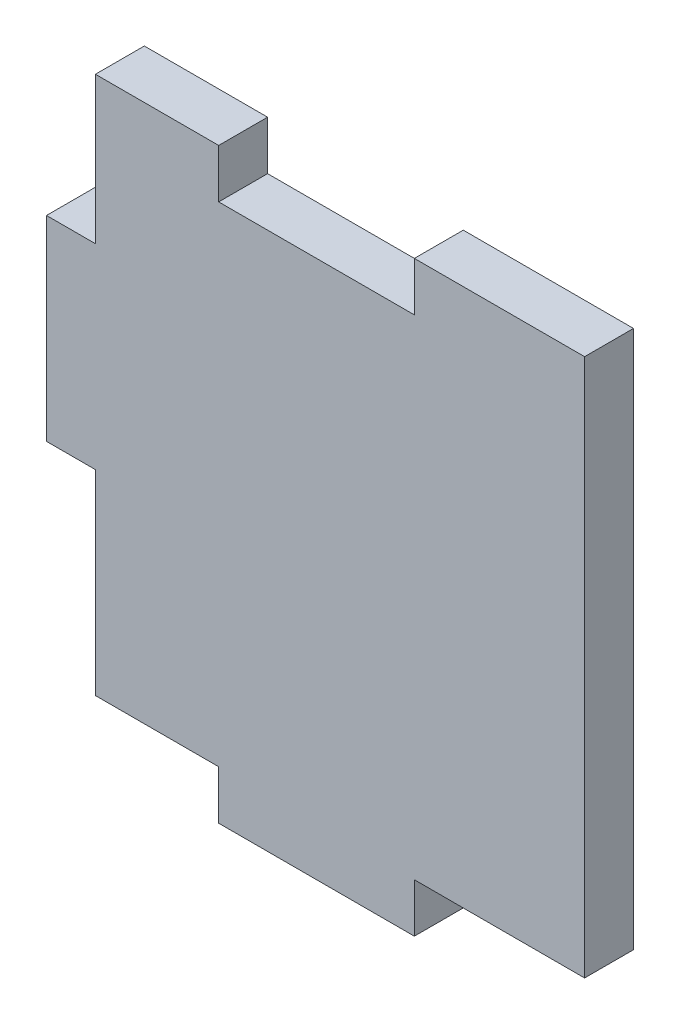
ISO-10303-21;
HEADER;
FILE_DESCRIPTION(('STEP AP214'),'2;1');
FILE_NAME('part.step','',(''),(''),'','','');
FILE_SCHEMA(('AUTOMOTIVE_DESIGN { 1 0 10303 214 1 1 1 1 }'));
ENDSEC;
DATA;
#1=APPLICATION_CONTEXT('core data for automotive mechanical design processes');
#2=APPLICATION_PROTOCOL_DEFINITION('international standard','automotive_design',2000,#1);
#3=PRODUCT_CONTEXT('',#1,'mechanical');
#4=PRODUCT('Part','Part','',(#3));
#5=PRODUCT_RELATED_PRODUCT_CATEGORY('part','',(#4));
#6=PRODUCT_DEFINITION_FORMATION('','',#4);
#7=PRODUCT_DEFINITION_CONTEXT('part definition',#1,'design');
#8=PRODUCT_DEFINITION('design','',#6,#7);
#9=PRODUCT_DEFINITION_SHAPE('','',#8);
#10=(LENGTH_UNIT() NAMED_UNIT(*) SI_UNIT(.MILLI.,.METRE.));
#11=(NAMED_UNIT(*) PLANE_ANGLE_UNIT() SI_UNIT($,.RADIAN.));
#12=(NAMED_UNIT(*) SI_UNIT($,.STERADIAN.) SOLID_ANGLE_UNIT());
#13=UNCERTAINTY_MEASURE_WITH_UNIT(LENGTH_MEASURE(1.E-05),#10,'distance_accuracy_value','');
#14=(GEOMETRIC_REPRESENTATION_CONTEXT(3) GLOBAL_UNCERTAINTY_ASSIGNED_CONTEXT((#13)) GLOBAL_UNIT_ASSIGNED_CONTEXT((#10,
#11,#12)) REPRESENTATION_CONTEXT('',''));
#15=CARTESIAN_POINT('',(0.,0.,0.));
#16=DIRECTION('',(0.,0.,1.));
#17=DIRECTION('',(1.,0.,0.));
#18=AXIS2_PLACEMENT_3D('',#15,#16,#17);
#19=CARTESIAN_POINT('',(0.,31.75,6.35));
#20=DIRECTION('',(1.,0.,0.));
#21=DIRECTION('',(0.,0.,-1.));
#22=AXIS2_PLACEMENT_3D('',#19,#20,#21);
#23=PLANE('',#22);
#24=DIRECTION('',(0.,-1.,0.));
#25=VECTOR('',#24,1.);
#26=CARTESIAN_POINT('',(0.,31.75,0.));
#27=LINE('',#26,#25);
#28=CARTESIAN_POINT('',(0.,31.75,0.));
#29=VERTEX_POINT('',#28);
#30=CARTESIAN_POINT('',(0.,6.34999999999999,0.));
#31=VERTEX_POINT('',#30);
#32=EDGE_CURVE('E175',#29,#31,#27,.T.);
#33=ORIENTED_EDGE('',*,*,#32,.T.);
#34=DIRECTION('',(0.,0.,-1.));
#35=VECTOR('',#34,1.);
#36=CARTESIAN_POINT('',(0.,6.34999999999999,6.35));
#37=LINE('',#36,#35);
#38=CARTESIAN_POINT('',(0.,6.34999999999999,6.35));
#39=VERTEX_POINT('',#38);
#40=EDGE_CURVE('E11',#39,#31,#37,.T.);
#41=ORIENTED_EDGE('',*,*,#40,.F.);
#42=DIRECTION('',(0.,-1.,0.));
#43=VECTOR('',#42,1.);
#44=CARTESIAN_POINT('',(0.,31.75,6.35));
#45=LINE('',#44,#43);
#46=CARTESIAN_POINT('',(0.,31.75,6.35));
#47=VERTEX_POINT('',#46);
#48=EDGE_CURVE('E205',#47,#39,#45,.T.);
#49=ORIENTED_EDGE('',*,*,#48,.F.);
#50=DIRECTION('',(0.,0.,-1.));
#51=VECTOR('',#50,1.);
#52=CARTESIAN_POINT('',(0.,31.75,6.35));
#53=LINE('',#52,#51);
#54=EDGE_CURVE('E171',#47,#29,#53,.T.);
#55=ORIENTED_EDGE('',*,*,#54,.T.);
#56=EDGE_LOOP('',(#33,#41,#49,#55));
#57=FACE_BOUND('',#56,.T.);
#58=ADVANCED_FACE('F31',(#57),#23,.F.);
#59=CARTESIAN_POINT('',(0.,6.34999999999999,6.35));
#60=DIRECTION('',(0.,1.,0.));
#61=DIRECTION('',(-1.,0.,0.));
#62=AXIS2_PLACEMENT_3D('',#59,#60,#61);
#63=PLANE('',#62);
#64=DIRECTION('',(1.,0.,0.));
#65=VECTOR('',#64,1.);
#66=CARTESIAN_POINT('',(0.,6.34999999999999,0.));
#67=LINE('',#66,#65);
#68=CARTESIAN_POINT('',(16.002,6.35,0.));
#69=VERTEX_POINT('',#68);
#70=EDGE_CURVE('E178',#31,#69,#67,.T.);
#71=ORIENTED_EDGE('',*,*,#70,.T.);
#72=DIRECTION('',(0.,0.,-1.));
#73=VECTOR('',#72,1.);
#74=CARTESIAN_POINT('',(16.002,6.35,6.35));
#75=LINE('',#74,#73);
#76=CARTESIAN_POINT('',(16.002,6.35,6.35));
#77=VERTEX_POINT('',#76);
#78=EDGE_CURVE('E39',#77,#69,#75,.T.);
#79=ORIENTED_EDGE('',*,*,#78,.F.);
#80=DIRECTION('',(1.,0.,0.));
#81=VECTOR('',#80,1.);
#82=CARTESIAN_POINT('',(0.,6.34999999999999,6.35));
#83=LINE('',#82,#81);
#84=EDGE_CURVE('E114',#39,#77,#83,.T.);
#85=ORIENTED_EDGE('',*,*,#84,.F.);
#86=ORIENTED_EDGE('',*,*,#40,.T.);
#87=EDGE_LOOP('',(#71,#79,#85,#86));
#88=FACE_BOUND('',#87,.T.);
#89=ADVANCED_FACE('F303',(#88),#63,.F.);
#90=CARTESIAN_POINT('',(16.002,6.35,6.35));
#91=DIRECTION('',(1.,0.,0.));
#92=DIRECTION('',(0.,1.,0.));
#93=AXIS2_PLACEMENT_3D('',#90,#91,#92);
#94=PLANE('',#93);
#95=DIRECTION('',(0.,-1.,0.));
#96=VECTOR('',#95,1.);
#97=CARTESIAN_POINT('',(16.002,6.35,0.));
#98=LINE('',#97,#96);
#99=CARTESIAN_POINT('',(16.002,0.,0.));
#100=VERTEX_POINT('',#99);
#101=EDGE_CURVE('E180',#69,#100,#98,.T.);
#102=ORIENTED_EDGE('',*,*,#101,.T.);
#103=DIRECTION('',(0.,0.,-1.));
#104=VECTOR('',#103,1.);
#105=CARTESIAN_POINT('',(16.002,0.,6.35));
#106=LINE('',#105,#104);
#107=CARTESIAN_POINT('',(16.002,0.,6.35));
#108=VERTEX_POINT('',#107);
#109=EDGE_CURVE('E236',#108,#100,#106,.T.);
#110=ORIENTED_EDGE('',*,*,#109,.F.);
#111=DIRECTION('',(0.,-1.,0.));
#112=VECTOR('',#111,1.);
#113=CARTESIAN_POINT('',(16.002,6.35,6.35));
#114=LINE('',#113,#112);
#115=EDGE_CURVE('E244',#77,#108,#114,.T.);
#116=ORIENTED_EDGE('',*,*,#115,.F.);
#117=ORIENTED_EDGE('',*,*,#78,.T.);
#118=EDGE_LOOP('',(#102,#110,#116,#117));
#119=FACE_BOUND('',#118,.T.);
#120=ADVANCED_FACE('F242',(#119),#94,.F.);
#121=CARTESIAN_POINT('',(16.002,0.,6.35));
#122=DIRECTION('',(0.,1.,0.));
#123=DIRECTION('',(-1.,0.,0.));
#124=AXIS2_PLACEMENT_3D('',#121,#122,#123);
#125=PLANE('',#124);
#126=DIRECTION('',(1.,0.,0.));
#127=VECTOR('',#126,1.);
#128=CARTESIAN_POINT('',(16.002,0.,0.));
#129=LINE('',#128,#127);
#130=CARTESIAN_POINT('',(41.402,0.,0.));
#131=VERTEX_POINT('',#130);
#132=EDGE_CURVE('E182',#100,#131,#129,.T.);
#133=ORIENTED_EDGE('',*,*,#132,.T.);
#134=DIRECTION('',(0.,0.,-1.));
#135=VECTOR('',#134,1.);
#136=CARTESIAN_POINT('',(41.402,0.,6.35));
#137=LINE('',#136,#135);
#138=CARTESIAN_POINT('',(41.402,0.,6.35));
#139=VERTEX_POINT('',#138);
#140=EDGE_CURVE('E233',#139,#131,#137,.T.);
#141=ORIENTED_EDGE('',*,*,#140,.F.);
#142=DIRECTION('',(1.,0.,0.));
#143=VECTOR('',#142,1.);
#144=CARTESIAN_POINT('',(16.002,0.,6.35));
#145=LINE('',#144,#143);
#146=EDGE_CURVE('E262',#108,#139,#145,.T.);
#147=ORIENTED_EDGE('',*,*,#146,.F.);
#148=ORIENTED_EDGE('',*,*,#109,.T.);
#149=EDGE_LOOP('',(#133,#141,#147,#148));
#150=FACE_BOUND('',#149,.T.);
#151=ADVANCED_FACE('F253',(#150),#125,.F.);
#152=CARTESIAN_POINT('',(41.402,0.,6.35));
#153=DIRECTION('',(-1.,0.,0.));
#154=DIRECTION('',(0.,-1.,0.));
#155=AXIS2_PLACEMENT_3D('',#152,#153,#154);
#156=PLANE('',#155);
#157=DIRECTION('',(0.,1.,0.));
#158=VECTOR('',#157,1.);
#159=CARTESIAN_POINT('',(41.402,0.,0.));
#160=LINE('',#159,#158);
#161=CARTESIAN_POINT('',(41.402,6.35000000000001,0.));
#162=VERTEX_POINT('',#161);
#163=EDGE_CURVE('E184',#131,#162,#160,.T.);
#164=ORIENTED_EDGE('',*,*,#163,.T.);
#165=DIRECTION('',(0.,0.,-1.));
#166=VECTOR('',#165,1.);
#167=CARTESIAN_POINT('',(41.402,6.35000000000001,6.35));
#168=LINE('',#167,#166);
#169=CARTESIAN_POINT('',(41.402,6.35000000000001,6.35));
#170=VERTEX_POINT('',#169);
#171=EDGE_CURVE('E230',#170,#162,#168,.T.);
#172=ORIENTED_EDGE('',*,*,#171,.F.);
#173=DIRECTION('',(0.,1.,0.));
#174=VECTOR('',#173,1.);
#175=CARTESIAN_POINT('',(41.402,0.,6.35));
#176=LINE('',#175,#174);
#177=EDGE_CURVE('E259',#139,#170,#176,.T.);
#178=ORIENTED_EDGE('',*,*,#177,.F.);
#179=ORIENTED_EDGE('',*,*,#140,.T.);
#180=EDGE_LOOP('',(#164,#172,#178,#179));
#181=FACE_BOUND('',#180,.T.);
#182=ADVANCED_FACE('F257',(#181),#156,.F.);
#183=CARTESIAN_POINT('',(41.402,6.35000000000001,6.35));
#184=DIRECTION('',(0.,1.,0.));
#185=DIRECTION('',(-1.,0.,0.));
#186=AXIS2_PLACEMENT_3D('',#183,#184,#185);
#187=PLANE('',#186);
#188=DIRECTION('',(1.,0.,0.));
#189=VECTOR('',#188,1.);
#190=CARTESIAN_POINT('',(41.402,6.35000000000001,0.));
#191=LINE('',#190,#189);
#192=CARTESIAN_POINT('',(63.5,6.34999999999999,0.));
#193=VERTEX_POINT('',#192);
#194=EDGE_CURVE('E186',#162,#193,#191,.T.);
#195=ORIENTED_EDGE('',*,*,#194,.T.);
#196=DIRECTION('',(0.,0.,-1.));
#197=VECTOR('',#196,1.);
#198=CARTESIAN_POINT('',(63.5,6.34999999999999,6.35));
#199=LINE('',#198,#197);
#200=CARTESIAN_POINT('',(63.5,6.34999999999999,6.35));
#201=VERTEX_POINT('',#200);
#202=EDGE_CURVE('E227',#201,#193,#199,.T.);
#203=ORIENTED_EDGE('',*,*,#202,.F.);
#204=DIRECTION('',(1.,0.,0.));
#205=VECTOR('',#204,1.);
#206=CARTESIAN_POINT('',(41.402,6.35000000000001,6.35));
#207=LINE('',#206,#205);
#208=EDGE_CURVE('E261',#170,#201,#207,.T.);
#209=ORIENTED_EDGE('',*,*,#208,.F.);
#210=ORIENTED_EDGE('',*,*,#171,.T.);
#211=EDGE_LOOP('',(#195,#203,#209,#210));
#212=FACE_BOUND('',#211,.T.);
#213=ADVANCED_FACE('F316',(#212),#187,.F.);
#214=CARTESIAN_POINT('',(63.5,6.34999999999999,6.35));
#215=DIRECTION('',(-1.,0.,0.));
#216=DIRECTION('',(0.,0.,1.));
#217=AXIS2_PLACEMENT_3D('',#214,#215,#216);
#218=PLANE('',#217);
#219=DIRECTION('',(0.,1.,0.));
#220=VECTOR('',#219,1.);
#221=CARTESIAN_POINT('',(63.5,6.34999999999999,0.));
#222=LINE('',#221,#220);
#223=CARTESIAN_POINT('',(63.5,76.2,0.));
#224=VERTEX_POINT('',#223);
#225=EDGE_CURVE('E188',#193,#224,#222,.T.);
#226=ORIENTED_EDGE('',*,*,#225,.T.);
#227=DIRECTION('',(0.,0.,-1.));
#228=VECTOR('',#227,1.);
#229=CARTESIAN_POINT('',(63.5,76.2,6.35));
#230=LINE('',#229,#228);
#231=CARTESIAN_POINT('',(63.5,76.2,6.35));
#232=VERTEX_POINT('',#231);
#233=EDGE_CURVE('E224',#232,#224,#230,.T.);
#234=ORIENTED_EDGE('',*,*,#233,.F.);
#235=DIRECTION('',(0.,1.,0.));
#236=VECTOR('',#235,1.);
#237=CARTESIAN_POINT('',(63.5,6.34999999999999,6.35));
#238=LINE('',#237,#236);
#239=EDGE_CURVE('E264',#201,#232,#238,.T.);
#240=ORIENTED_EDGE('',*,*,#239,.F.);
#241=ORIENTED_EDGE('',*,*,#202,.T.);
#242=EDGE_LOOP('',(#226,#234,#240,#241));
#243=FACE_BOUND('',#242,.T.);
#244=ADVANCED_FACE('F319',(#243),#218,.F.);
#245=CARTESIAN_POINT('',(63.5,76.2,6.35));
#246=DIRECTION('',(0.,-1.,0.));
#247=DIRECTION('',(1.,0.,0.));
#248=AXIS2_PLACEMENT_3D('',#245,#246,#247);
#249=PLANE('',#248);
#250=DIRECTION('',(-1.,0.,0.));
#251=VECTOR('',#250,1.);
#252=CARTESIAN_POINT('',(63.5,76.2,0.));
#253=LINE('',#252,#251);
#254=CARTESIAN_POINT('',(41.402,76.2,0.));
#255=VERTEX_POINT('',#254);
#256=EDGE_CURVE('E190',#224,#255,#253,.T.);
#257=ORIENTED_EDGE('',*,*,#256,.T.);
#258=DIRECTION('',(0.,0.,-1.));
#259=VECTOR('',#258,1.);
#260=CARTESIAN_POINT('',(41.402,76.2,6.35));
#261=LINE('',#260,#259);
#262=CARTESIAN_POINT('',(41.402,76.2,6.35));
#263=VERTEX_POINT('',#262);
#264=EDGE_CURVE('E221',#263,#255,#261,.T.);
#265=ORIENTED_EDGE('',*,*,#264,.F.);
#266=DIRECTION('',(-1.,0.,0.));
#267=VECTOR('',#266,1.);
#268=CARTESIAN_POINT('',(63.5,76.2,6.35));
#269=LINE('',#268,#267);
#270=EDGE_CURVE('E270',#232,#263,#269,.T.);
#271=ORIENTED_EDGE('',*,*,#270,.F.);
#272=ORIENTED_EDGE('',*,*,#233,.T.);
#273=EDGE_LOOP('',(#257,#265,#271,#272));
#274=FACE_BOUND('',#273,.T.);
#275=ADVANCED_FACE('F323',(#274),#249,.F.);
#276=CARTESIAN_POINT('',(41.402,69.85,6.35));
#277=DIRECTION('',(1.,0.,0.));
#278=DIRECTION('',(0.,0.,-1.));
#279=AXIS2_PLACEMENT_3D('',#276,#277,#278);
#280=PLANE('',#279);
#281=DIRECTION('',(0.,-1.,0.));
#282=VECTOR('',#281,1.);
#283=CARTESIAN_POINT('',(41.402,69.85,0.));
#284=LINE('',#283,#282);
#285=CARTESIAN_POINT('',(41.402,69.85,0.));
#286=VERTEX_POINT('',#285);
#287=EDGE_CURVE('E192',#255,#286,#284,.T.);
#288=ORIENTED_EDGE('',*,*,#287,.T.);
#289=DIRECTION('',(0.,0.,-1.));
#290=VECTOR('',#289,1.);
#291=CARTESIAN_POINT('',(41.402,69.85,6.35));
#292=LINE('',#291,#290);
#293=CARTESIAN_POINT('',(41.402,69.85,6.35));
#294=VERTEX_POINT('',#293);
#295=EDGE_CURVE('E218',#294,#286,#292,.T.);
#296=ORIENTED_EDGE('',*,*,#295,.F.);
#297=DIRECTION('',(0.,-1.,0.));
#298=VECTOR('',#297,1.);
#299=CARTESIAN_POINT('',(41.402,69.85,6.35));
#300=LINE('',#299,#298);
#301=EDGE_CURVE('E272',#263,#294,#300,.T.);
#302=ORIENTED_EDGE('',*,*,#301,.F.);
#303=ORIENTED_EDGE('',*,*,#264,.T.);
#304=EDGE_LOOP('',(#288,#296,#302,#303));
#305=FACE_BOUND('',#304,.T.);
#306=ADVANCED_FACE('F327',(#305),#280,.F.);
#307=CARTESIAN_POINT('',(16.002,69.85,6.35));
#308=DIRECTION('',(0.,-1.,0.));
#309=DIRECTION('',(1.,0.,0.));
#310=AXIS2_PLACEMENT_3D('',#307,#308,#309);
#311=PLANE('',#310);
#312=DIRECTION('',(-1.,0.,0.));
#313=VECTOR('',#312,1.);
#314=CARTESIAN_POINT('',(16.002,69.85,0.));
#315=LINE('',#314,#313);
#316=CARTESIAN_POINT('',(16.002,69.85,0.));
#317=VERTEX_POINT('',#316);
#318=EDGE_CURVE('E194',#286,#317,#315,.T.);
#319=ORIENTED_EDGE('',*,*,#318,.T.);
#320=DIRECTION('',(0.,0.,-1.));
#321=VECTOR('',#320,1.);
#322=CARTESIAN_POINT('',(16.002,69.85,6.35));
#323=LINE('',#322,#321);
#324=CARTESIAN_POINT('',(16.002,69.85,6.35));
#325=VERTEX_POINT('',#324);
#326=EDGE_CURVE('E215',#325,#317,#323,.T.);
#327=ORIENTED_EDGE('',*,*,#326,.F.);
#328=DIRECTION('',(-1.,0.,0.));
#329=VECTOR('',#328,1.);
#330=CARTESIAN_POINT('',(16.002,69.85,6.35));
#331=LINE('',#330,#329);
#332=EDGE_CURVE('E274',#294,#325,#331,.T.);
#333=ORIENTED_EDGE('',*,*,#332,.F.);
#334=ORIENTED_EDGE('',*,*,#295,.T.);
#335=EDGE_LOOP('',(#319,#327,#333,#334));
#336=FACE_BOUND('',#335,.T.);
#337=ADVANCED_FACE('F331',(#336),#311,.F.);
#338=CARTESIAN_POINT('',(16.002,76.2,6.35));
#339=DIRECTION('',(-1.,0.,0.));
#340=DIRECTION('',(0.,0.,1.));
#341=AXIS2_PLACEMENT_3D('',#338,#339,#340);
#342=PLANE('',#341);
#343=DIRECTION('',(0.,1.,0.));
#344=VECTOR('',#343,1.);
#345=CARTESIAN_POINT('',(16.002,76.2,0.));
#346=LINE('',#345,#344);
#347=CARTESIAN_POINT('',(16.002,76.2,0.));
#348=VERTEX_POINT('',#347);
#349=EDGE_CURVE('E196',#317,#348,#346,.T.);
#350=ORIENTED_EDGE('',*,*,#349,.T.);
#351=DIRECTION('',(0.,0.,-1.));
#352=VECTOR('',#351,1.);
#353=CARTESIAN_POINT('',(16.002,76.2,6.35));
#354=LINE('',#353,#352);
#355=CARTESIAN_POINT('',(16.002,76.2,6.35));
#356=VERTEX_POINT('',#355);
#357=EDGE_CURVE('E212',#356,#348,#354,.T.);
#358=ORIENTED_EDGE('',*,*,#357,.F.);
#359=DIRECTION('',(0.,1.,0.));
#360=VECTOR('',#359,1.);
#361=CARTESIAN_POINT('',(16.002,76.2,6.35));
#362=LINE('',#361,#360);
#363=EDGE_CURVE('E276',#325,#356,#362,.T.);
#364=ORIENTED_EDGE('',*,*,#363,.F.);
#365=ORIENTED_EDGE('',*,*,#326,.T.);
#366=EDGE_LOOP('',(#350,#358,#364,#365));
#367=FACE_BOUND('',#366,.T.);
#368=ADVANCED_FACE('F335',(#367),#342,.F.);
#369=CARTESIAN_POINT('',(16.002,76.2,6.35));
#370=DIRECTION('',(0.,-1.,0.));
#371=DIRECTION('',(0.,0.,-1.));
#372=AXIS2_PLACEMENT_3D('',#369,#370,#371);
#373=PLANE('',#372);
#374=DIRECTION('',(-1.,0.,0.));
#375=VECTOR('',#374,1.);
#376=CARTESIAN_POINT('',(16.002,76.2,0.));
#377=LINE('',#376,#375);
#378=CARTESIAN_POINT('',(0.,76.2,0.));
#379=VERTEX_POINT('',#378);
#380=EDGE_CURVE('E198',#348,#379,#377,.T.);
#381=ORIENTED_EDGE('',*,*,#380,.T.);
#382=DIRECTION('',(0.,0.,-1.));
#383=VECTOR('',#382,1.);
#384=CARTESIAN_POINT('',(0.,76.2,6.35));
#385=LINE('',#384,#383);
#386=CARTESIAN_POINT('',(0.,76.2,6.35));
#387=VERTEX_POINT('',#386);
#388=EDGE_CURVE('E209',#387,#379,#385,.T.);
#389=ORIENTED_EDGE('',*,*,#388,.F.);
#390=DIRECTION('',(-1.,0.,0.));
#391=VECTOR('',#390,1.);
#392=CARTESIAN_POINT('',(16.002,76.2,6.35));
#393=LINE('',#392,#391);
#394=EDGE_CURVE('E278',#356,#387,#393,.T.);
#395=ORIENTED_EDGE('',*,*,#394,.F.);
#396=ORIENTED_EDGE('',*,*,#357,.T.);
#397=EDGE_LOOP('',(#381,#389,#395,#396));
#398=FACE_BOUND('',#397,.T.);
#399=ADVANCED_FACE('F284',(#398),#373,.F.);
#400=CARTESIAN_POINT('',(0.,76.2,6.35));
#401=DIRECTION('',(1.,0.,0.));
#402=DIRECTION('',(0.,1.,0.));
#403=AXIS2_PLACEMENT_3D('',#400,#401,#402);
#404=PLANE('',#403);
#405=DIRECTION('',(0.,-1.,0.));
#406=VECTOR('',#405,1.);
#407=CARTESIAN_POINT('',(0.,76.2,0.));
#408=LINE('',#407,#406);
#409=CARTESIAN_POINT('',(0.,57.15,0.));
#410=VERTEX_POINT('',#409);
#411=EDGE_CURVE('E200',#379,#410,#408,.T.);
#412=ORIENTED_EDGE('',*,*,#411,.T.);
#413=DIRECTION('',(0.,0.,-1.));
#414=VECTOR('',#413,1.);
#415=CARTESIAN_POINT('',(0.,57.15,6.35));
#416=LINE('',#415,#414);
#417=CARTESIAN_POINT('',(0.,57.15,6.35));
#418=VERTEX_POINT('',#417);
#419=EDGE_CURVE('E166',#418,#410,#416,.T.);
#420=ORIENTED_EDGE('',*,*,#419,.F.);
#421=DIRECTION('',(0.,-1.,0.));
#422=VECTOR('',#421,1.);
#423=CARTESIAN_POINT('',(0.,76.2,6.35));
#424=LINE('',#423,#422);
#425=EDGE_CURVE('E157',#387,#418,#424,.T.);
#426=ORIENTED_EDGE('',*,*,#425,.F.);
#427=ORIENTED_EDGE('',*,*,#388,.T.);
#428=EDGE_LOOP('',(#412,#420,#426,#427));
#429=FACE_BOUND('',#428,.T.);
#430=ADVANCED_FACE('F288',(#429),#404,.F.);
#431=CARTESIAN_POINT('',(0.,57.15,6.35));
#432=DIRECTION('',(0.,-1.,0.));
#433=DIRECTION('',(1.,0.,0.));
#434=AXIS2_PLACEMENT_3D('',#431,#432,#433);
#435=PLANE('',#434);
#436=DIRECTION('',(-1.,0.,0.));
#437=VECTOR('',#436,1.);
#438=CARTESIAN_POINT('',(0.,57.15,0.));
#439=LINE('',#438,#437);
#440=CARTESIAN_POINT('',(-6.35000000000001,57.15,0.));
#441=VERTEX_POINT('',#440);
#442=EDGE_CURVE('E165',#410,#441,#439,.T.);
#443=ORIENTED_EDGE('',*,*,#442,.T.);
#444=DIRECTION('',(0.,0.,-1.));
#445=VECTOR('',#444,1.);
#446=CARTESIAN_POINT('',(-6.35000000000001,57.15,6.35));
#447=LINE('',#446,#445);
#448=CARTESIAN_POINT('',(-6.35000000000001,57.15,6.35));
#449=VERTEX_POINT('',#448);
#450=EDGE_CURVE('E162',#449,#441,#447,.T.);
#451=ORIENTED_EDGE('',*,*,#450,.F.);
#452=DIRECTION('',(-1.,0.,0.));
#453=VECTOR('',#452,1.);
#454=CARTESIAN_POINT('',(0.,57.15,6.35));
#455=LINE('',#454,#453);
#456=EDGE_CURVE('E151',#418,#449,#455,.T.);
#457=ORIENTED_EDGE('',*,*,#456,.F.);
#458=ORIENTED_EDGE('',*,*,#419,.T.);
#459=EDGE_LOOP('',(#443,#451,#457,#458));
#460=FACE_BOUND('',#459,.T.);
#461=ADVANCED_FACE('F163',(#460),#435,.F.);
#462=CARTESIAN_POINT('',(-6.35000000000001,57.15,6.35));
#463=DIRECTION('',(1.,0.,0.));
#464=DIRECTION('',(0.,0.,-1.));
#465=AXIS2_PLACEMENT_3D('',#462,#463,#464);
#466=PLANE('',#465);
#467=DIRECTION('',(0.,-1.,0.));
#468=VECTOR('',#467,1.);
#469=CARTESIAN_POINT('',(-6.35000000000001,57.15,0.));
#470=LINE('',#469,#468);
#471=CARTESIAN_POINT('',(-6.35000000000001,31.75,0.));
#472=VERTEX_POINT('',#471);
#473=EDGE_CURVE('E100',#441,#472,#470,.T.);
#474=ORIENTED_EDGE('',*,*,#473,.T.);
#475=DIRECTION('',(0.,0.,-1.));
#476=VECTOR('',#475,1.);
#477=CARTESIAN_POINT('',(-6.35000000000001,31.75,6.35));
#478=LINE('',#477,#476);
#479=CARTESIAN_POINT('',(-6.35000000000001,31.75,6.35));
#480=VERTEX_POINT('',#479);
#481=EDGE_CURVE('E167',#480,#472,#478,.T.);
#482=ORIENTED_EDGE('',*,*,#481,.F.);
#483=DIRECTION('',(0.,-1.,0.));
#484=VECTOR('',#483,1.);
#485=CARTESIAN_POINT('',(-6.35000000000001,57.15,6.35));
#486=LINE('',#485,#484);
#487=EDGE_CURVE('E155',#449,#480,#486,.T.);
#488=ORIENTED_EDGE('',*,*,#487,.F.);
#489=ORIENTED_EDGE('',*,*,#450,.T.);
#490=EDGE_LOOP('',(#474,#482,#488,#489));
#491=FACE_BOUND('',#490,.T.);
#492=ADVANCED_FACE('F169',(#491),#466,.F.);
#493=CARTESIAN_POINT('',(-6.35000000000001,31.75,6.35));
#494=DIRECTION('',(0.,1.,0.));
#495=DIRECTION('',(-1.,0.,0.));
#496=AXIS2_PLACEMENT_3D('',#493,#494,#495);
#497=PLANE('',#496);
#498=DIRECTION('',(1.,0.,0.));
#499=VECTOR('',#498,1.);
#500=CARTESIAN_POINT('',(-6.35000000000001,31.75,0.));
#501=LINE('',#500,#499);
#502=EDGE_CURVE('E106',#472,#29,#501,.T.);
#503=ORIENTED_EDGE('',*,*,#502,.T.);
#504=ORIENTED_EDGE('',*,*,#54,.F.);
#505=DIRECTION('',(1.,0.,0.));
#506=VECTOR('',#505,1.);
#507=CARTESIAN_POINT('',(-6.35000000000001,31.75,6.35));
#508=LINE('',#507,#506);
#509=EDGE_CURVE('E47',#480,#47,#508,.T.);
#510=ORIENTED_EDGE('',*,*,#509,.F.);
#511=ORIENTED_EDGE('',*,*,#481,.T.);
#512=EDGE_LOOP('',(#503,#504,#510,#511));
#513=FACE_BOUND('',#512,.T.);
#514=ADVANCED_FACE('F292',(#513),#497,.F.);
#515=CARTESIAN_POINT('',(0.,6.34999999999999,6.35));
#516=DIRECTION('',(0.,0.,1.));
#517=DIRECTION('',(1.,0.,0.));
#518=AXIS2_PLACEMENT_3D('',#515,#516,#517);
#519=PLANE('',#518);
#520=ORIENTED_EDGE('',*,*,#48,.T.);
#521=ORIENTED_EDGE('',*,*,#84,.T.);
#522=ORIENTED_EDGE('',*,*,#115,.T.);
#523=ORIENTED_EDGE('',*,*,#146,.T.);
#524=ORIENTED_EDGE('',*,*,#177,.T.);
#525=ORIENTED_EDGE('',*,*,#208,.T.);
#526=ORIENTED_EDGE('',*,*,#239,.T.);
#527=ORIENTED_EDGE('',*,*,#270,.T.);
#528=ORIENTED_EDGE('',*,*,#301,.T.);
#529=ORIENTED_EDGE('',*,*,#332,.T.);
#530=ORIENTED_EDGE('',*,*,#363,.T.);
#531=ORIENTED_EDGE('',*,*,#394,.T.);
#532=ORIENTED_EDGE('',*,*,#425,.T.);
#533=ORIENTED_EDGE('',*,*,#456,.T.);
#534=ORIENTED_EDGE('',*,*,#487,.T.);
#535=ORIENTED_EDGE('',*,*,#509,.T.);
#536=EDGE_LOOP('',(#520,#521,#522,#523,#524,#525,#526,#527,#528,#529,#530,#531,#532,#533,#534,#535));
#537=FACE_BOUND('',#536,.T.);
#538=ADVANCED_FACE('F153',(#537),#519,.T.);
#539=CARTESIAN_POINT('',(0.,6.34999999999999,0.));
#540=DIRECTION('',(0.,0.,1.));
#541=DIRECTION('',(1.,0.,0.));
#542=AXIS2_PLACEMENT_3D('',#539,#540,#541);
#543=PLANE('',#542);
#544=ORIENTED_EDGE('',*,*,#32,.F.);
#545=ORIENTED_EDGE('',*,*,#502,.F.);
#546=ORIENTED_EDGE('',*,*,#473,.F.);
#547=ORIENTED_EDGE('',*,*,#442,.F.);
#548=ORIENTED_EDGE('',*,*,#411,.F.);
#549=ORIENTED_EDGE('',*,*,#380,.F.);
#550=ORIENTED_EDGE('',*,*,#349,.F.);
#551=ORIENTED_EDGE('',*,*,#318,.F.);
#552=ORIENTED_EDGE('',*,*,#287,.F.);
#553=ORIENTED_EDGE('',*,*,#256,.F.);
#554=ORIENTED_EDGE('',*,*,#225,.F.);
#555=ORIENTED_EDGE('',*,*,#194,.F.);
#556=ORIENTED_EDGE('',*,*,#163,.F.);
#557=ORIENTED_EDGE('',*,*,#132,.F.);
#558=ORIENTED_EDGE('',*,*,#101,.F.);
#559=ORIENTED_EDGE('',*,*,#70,.F.);
#560=EDGE_LOOP('',(#544,#545,#546,#547,#548,#549,#550,#551,#552,#553,#554,#555,#556,#557,#558,#559));
#561=FACE_BOUND('',#560,.T.);
#562=ADVANCED_FACE('F248',(#561),#543,.F.);
#563=CLOSED_SHELL('',(#58,#89,#120,#151,#182,#213,#244,#275,#306,#337,#368,#399,#430,#461,#492,
#514,#538,#562));
#564=MANIFOLD_SOLID_BREP('B2',#563);
#565=ADVANCED_BREP_SHAPE_REPRESENTATION('',(#18,#564),#14);
#566=SHAPE_DEFINITION_REPRESENTATION(#9,#565);
ENDSEC;
END-ISO-10303-21;
